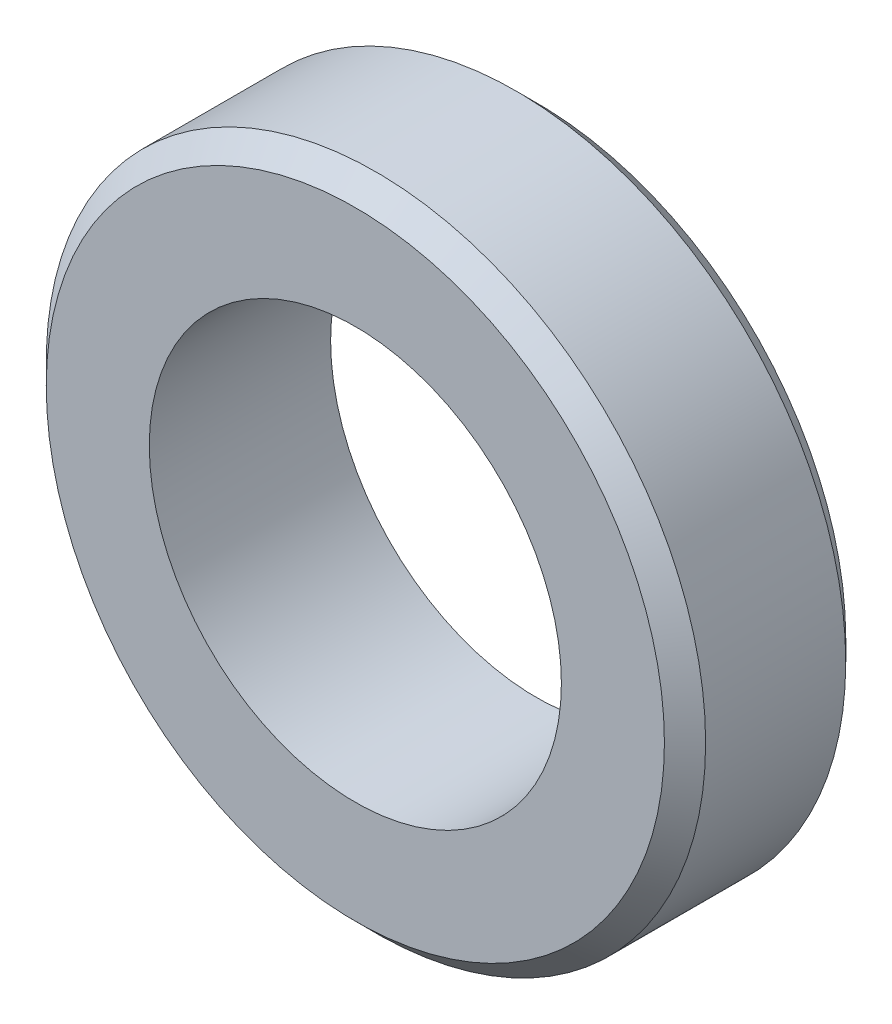
ISO-10303-21;
HEADER;
FILE_DESCRIPTION(('STEP AP214'),'2;1');
FILE_NAME('part.step','',(''),(''),'','','');
FILE_SCHEMA(('AUTOMOTIVE_DESIGN { 1 0 10303 214 1 1 1 1 }'));
ENDSEC;
DATA;
#1=APPLICATION_CONTEXT('core data for automotive mechanical design processes');
#2=APPLICATION_PROTOCOL_DEFINITION('international standard','automotive_design',2000,#1);
#3=PRODUCT_CONTEXT('',#1,'mechanical');
#4=PRODUCT('Part','Part','',(#3));
#5=PRODUCT_RELATED_PRODUCT_CATEGORY('part','',(#4));
#6=PRODUCT_DEFINITION_FORMATION('','',#4);
#7=PRODUCT_DEFINITION_CONTEXT('part definition',#1,'design');
#8=PRODUCT_DEFINITION('design','',#6,#7);
#9=PRODUCT_DEFINITION_SHAPE('','',#8);
#10=(LENGTH_UNIT() NAMED_UNIT(*) SI_UNIT(.MILLI.,.METRE.));
#11=(NAMED_UNIT(*) PLANE_ANGLE_UNIT() SI_UNIT($,.RADIAN.));
#12=(NAMED_UNIT(*) SI_UNIT($,.STERADIAN.) SOLID_ANGLE_UNIT());
#13=UNCERTAINTY_MEASURE_WITH_UNIT(LENGTH_MEASURE(1.E-05),#10,'distance_accuracy_value','');
#14=(GEOMETRIC_REPRESENTATION_CONTEXT(3) GLOBAL_UNCERTAINTY_ASSIGNED_CONTEXT((#13)) GLOBAL_UNIT_ASSIGNED_CONTEXT((#10,
#11,#12)) REPRESENTATION_CONTEXT('',''));
#15=CARTESIAN_POINT('',(0.,0.,0.));
#16=DIRECTION('',(0.,0.,1.));
#17=DIRECTION('',(1.,0.,0.));
#18=AXIS2_PLACEMENT_3D('',#15,#16,#17);
#19=CARTESIAN_POINT('',(0.,0.,6.985));
#20=DIRECTION('',(0.,0.,1.));
#21=DIRECTION('',(1.,0.,0.));
#22=AXIS2_PLACEMENT_3D('',#19,#20,#21);
#23=PLANE('',#22);
#24=CARTESIAN_POINT('',(0.,0.,6.985));
#25=DIRECTION('',(0.,0.,1.));
#26=DIRECTION('',(1.,0.,0.));
#27=AXIS2_PLACEMENT_3D('',#24,#25,#26);
#28=CIRCLE('',#27,11.90625);
#29=CARTESIAN_POINT('',(11.90625,0.,6.985));
#30=VERTEX_POINT('',#29);
#31=EDGE_CURVE('E10',#30,#30,#28,.T.);
#32=ORIENTED_EDGE('',*,*,#31,.T.);
#33=EDGE_LOOP('',(#32));
#34=FACE_BOUND('',#33,.T.);
#35=CARTESIAN_POINT('',(0.,0.,6.985));
#36=DIRECTION('',(0.,0.,1.));
#37=DIRECTION('',(1.,0.,0.));
#38=AXIS2_PLACEMENT_3D('',#35,#36,#37);
#39=CIRCLE('',#38,7.9375);
#40=CARTESIAN_POINT('',(7.9375,0.,6.985));
#41=VERTEX_POINT('',#40);
#42=EDGE_CURVE('E70',#41,#41,#39,.T.);
#43=ORIENTED_EDGE('',*,*,#42,.F.);
#44=EDGE_LOOP('',(#43));
#45=FACE_BOUND('',#44,.T.);
#46=ADVANCED_FACE('F45',(#34,#45),#23,.T.);
#47=CARTESIAN_POINT('',(0.,0.,0.));
#48=DIRECTION('',(0.,0.,1.));
#49=DIRECTION('',(1.,0.,0.));
#50=AXIS2_PLACEMENT_3D('',#47,#48,#49);
#51=PLANE('',#50);
#52=CARTESIAN_POINT('',(0.,0.,0.));
#53=DIRECTION('',(0.,0.,1.));
#54=DIRECTION('',(1.,0.,0.));
#55=AXIS2_PLACEMENT_3D('',#52,#53,#54);
#56=CIRCLE('',#55,11.90625);
#57=CARTESIAN_POINT('',(11.90625,0.,0.));
#58=VERTEX_POINT('',#57);
#59=EDGE_CURVE('E54',#58,#58,#56,.F.);
#60=ORIENTED_EDGE('',*,*,#59,.T.);
#61=EDGE_LOOP('',(#60));
#62=FACE_BOUND('',#61,.T.);
#63=CARTESIAN_POINT('',(0.,0.,0.));
#64=DIRECTION('',(0.,0.,1.));
#65=DIRECTION('',(1.,0.,0.));
#66=AXIS2_PLACEMENT_3D('',#63,#64,#65);
#67=CIRCLE('',#66,7.9375);
#68=CARTESIAN_POINT('',(7.9375,0.,0.));
#69=VERTEX_POINT('',#68);
#70=EDGE_CURVE('E71',#69,#69,#67,.T.);
#71=ORIENTED_EDGE('',*,*,#70,.T.);
#72=EDGE_LOOP('',(#71));
#73=FACE_BOUND('',#72,.T.);
#74=ADVANCED_FACE('F83',(#62,#73),#51,.F.);
#75=CARTESIAN_POINT('',(0.,0.,6.985));
#76=DIRECTION('',(0.,0.,-1.));
#77=DIRECTION('',(-1.,0.,0.));
#78=AXIS2_PLACEMENT_3D('',#75,#76,#77);
#79=CYLINDRICAL_SURFACE('',#78,12.7);
#80=CARTESIAN_POINT('',(0.,0.,0.793750000000001));
#81=DIRECTION('',(0.,0.,1.));
#82=DIRECTION('',(1.,0.,0.));
#83=AXIS2_PLACEMENT_3D('',#80,#81,#82);
#84=CIRCLE('',#83,12.7);
#85=CARTESIAN_POINT('',(12.7,0.,0.793750000000001));
#86=VERTEX_POINT('',#85);
#87=EDGE_CURVE('E59',#86,#86,#84,.T.);
#88=ORIENTED_EDGE('',*,*,#87,.T.);
#89=EDGE_LOOP('',(#88));
#90=FACE_BOUND('',#89,.T.);
#91=CARTESIAN_POINT('',(0.,0.,6.19124999999999));
#92=DIRECTION('',(0.,0.,1.));
#93=DIRECTION('',(1.,0.,0.));
#94=AXIS2_PLACEMENT_3D('',#91,#92,#93);
#95=CIRCLE('',#94,12.7);
#96=CARTESIAN_POINT('',(12.7,0.,6.19124999999999));
#97=VERTEX_POINT('',#96);
#98=EDGE_CURVE('E64',#97,#97,#95,.F.);
#99=ORIENTED_EDGE('',*,*,#98,.T.);
#100=EDGE_LOOP('',(#99));
#101=FACE_BOUND('',#100,.T.);
#102=ADVANCED_FACE('F89',(#90,#101),#79,.T.);
#103=CARTESIAN_POINT('',(0.,0.,6.985));
#104=DIRECTION('',(0.,0.,-1.));
#105=DIRECTION('',(-1.,0.,0.));
#106=AXIS2_PLACEMENT_3D('',#103,#104,#105);
#107=CYLINDRICAL_SURFACE('',#106,7.9375);
#108=ORIENTED_EDGE('',*,*,#42,.T.);
#109=EDGE_LOOP('',(#108));
#110=FACE_BOUND('',#109,.T.);
#111=ORIENTED_EDGE('',*,*,#70,.F.);
#112=EDGE_LOOP('',(#111));
#113=FACE_BOUND('',#112,.T.);
#114=ADVANCED_FACE('F79',(#110,#113),#107,.F.);
#115=CARTESIAN_POINT('',(0.,0.,0.793750000000001));
#116=DIRECTION('',(0.,0.,1.));
#117=DIRECTION('',(1.,0.,0.));
#118=AXIS2_PLACEMENT_3D('',#115,#116,#117);
#119=CONICAL_SURFACE('',#118,12.7,0.785398163397449);
#120=CARTESIAN_POINT('',(11.90625,0.,0.));
#121=CARTESIAN_POINT('',(11.9145182291667,0.,0.00826822916666704));
#122=CARTESIAN_POINT('',(11.9227864583333,0.,0.0165364583333336));
#123=CARTESIAN_POINT('',(11.9393229166667,0.,0.0330729166666666));
#124=CARTESIAN_POINT('',(11.9475911458333,0.,0.0413411458333332));
#125=CARTESIAN_POINT('',(11.9641276041667,0.,0.0578776041666665));
#126=CARTESIAN_POINT('',(11.9723958333333,0.,0.0661458333333333));
#127=CARTESIAN_POINT('',(11.9889322916667,0.,0.0826822916666668));
#128=CARTESIAN_POINT('',(11.9972005208333,0.,0.0909505208333336));
#129=CARTESIAN_POINT('',(12.0137369791667,0.,0.107486979166667));
#130=CARTESIAN_POINT('',(12.0220052083333,0.,0.115755208333333));
#131=CARTESIAN_POINT('',(12.0385416666667,0.,0.132291666666667));
#132=CARTESIAN_POINT('',(12.0468098958333,0.,0.140559895833334));
#133=CARTESIAN_POINT('',(12.0633463541667,0.,0.157096354166667));
#134=CARTESIAN_POINT('',(12.0716145833333,0.,0.165364583333333));
#135=CARTESIAN_POINT('',(12.0881510416667,0.,0.181901041666667));
#136=CARTESIAN_POINT('',(12.0964192708333,0.,0.190169270833333));
#137=CARTESIAN_POINT('',(12.1129557291667,0.,0.206705729166667));
#138=CARTESIAN_POINT('',(12.1212239583333,0.,0.214973958333334));
#139=CARTESIAN_POINT('',(12.1377604166667,0.,0.231510416666667));
#140=CARTESIAN_POINT('',(12.1460286458333,0.,0.239778645833334));
#141=CARTESIAN_POINT('',(12.1625651041667,0.,0.256315104166667));
#142=CARTESIAN_POINT('',(12.1708333333333,0.,0.264583333333334));
#143=CARTESIAN_POINT('',(12.1873697916667,0.,0.281119791666667));
#144=CARTESIAN_POINT('',(12.1956380208333,0.,0.289388020833334));
#145=CARTESIAN_POINT('',(12.2121744791667,0.,0.305924479166667));
#146=CARTESIAN_POINT('',(12.2204427083333,0.,0.314192708333333));
#147=CARTESIAN_POINT('',(12.2369791666667,0.,0.330729166666667));
#148=CARTESIAN_POINT('',(12.2452473958333,0.,0.338997395833334));
#149=CARTESIAN_POINT('',(12.2617838541667,0.,0.355533854166667));
#150=CARTESIAN_POINT('',(12.2700520833333,0.,0.363802083333334));
#151=CARTESIAN_POINT('',(12.2865885416667,0.,0.380338541666667));
#152=CARTESIAN_POINT('',(12.2948567708333,0.,0.388606770833334));
#153=CARTESIAN_POINT('',(12.3113932291667,0.,0.405143229166667));
#154=CARTESIAN_POINT('',(12.3196614583333,0.,0.413411458333334));
#155=CARTESIAN_POINT('',(12.3361979166667,0.,0.429947916666667));
#156=CARTESIAN_POINT('',(12.3444661458333,0.,0.438216145833334));
#157=CARTESIAN_POINT('',(12.3610026041667,0.,0.454752604166667));
#158=CARTESIAN_POINT('',(12.3692708333333,0.,0.463020833333334));
#159=CARTESIAN_POINT('',(12.3858072916667,0.,0.479557291666667));
#160=CARTESIAN_POINT('',(12.3940755208333,0.,0.487825520833334));
#161=CARTESIAN_POINT('',(12.4106119791667,0.,0.504361979166667));
#162=CARTESIAN_POINT('',(12.4188802083333,0.,0.512630208333334));
#163=CARTESIAN_POINT('',(12.4354166666667,0.,0.529166666666667));
#164=CARTESIAN_POINT('',(12.4436848958333,0.,0.537434895833334));
#165=CARTESIAN_POINT('',(12.4602213541667,0.,0.553971354166667));
#166=CARTESIAN_POINT('',(12.4684895833333,0.,0.562239583333334));
#167=CARTESIAN_POINT('',(12.4850260416667,0.,0.578776041666667));
#168=CARTESIAN_POINT('',(12.4932942708333,0.,0.587044270833334));
#169=CARTESIAN_POINT('',(12.5098307291667,0.,0.603580729166667));
#170=CARTESIAN_POINT('',(12.5180989583333,0.,0.611848958333334));
#171=CARTESIAN_POINT('',(12.5346354166667,0.,0.628385416666667));
#172=CARTESIAN_POINT('',(12.5429036458333,0.,0.636653645833334));
#173=CARTESIAN_POINT('',(12.5594401041667,0.,0.653190104166667));
#174=CARTESIAN_POINT('',(12.5677083333333,0.,0.661458333333334));
#175=CARTESIAN_POINT('',(12.5842447916667,0.,0.677994791666668));
#176=CARTESIAN_POINT('',(12.5925130208333,0.,0.686263020833334));
#177=CARTESIAN_POINT('',(12.6090494791667,0.,0.702799479166668));
#178=CARTESIAN_POINT('',(12.6173177083333,0.,0.711067708333334));
#179=CARTESIAN_POINT('',(12.6338541666667,0.,0.727604166666667));
#180=CARTESIAN_POINT('',(12.6421223958333,0.,0.735872395833334));
#181=CARTESIAN_POINT('',(12.6586588541667,0.,0.752408854166668));
#182=CARTESIAN_POINT('',(12.6669270833333,0.,0.760677083333334));
#183=CARTESIAN_POINT('',(12.6834635416667,0.,0.777213541666667));
#184=CARTESIAN_POINT('',(12.6917317708333,0.,0.785481770833334));
#185=CARTESIAN_POINT('',(12.7,0.,0.793750000000001));
#186=B_SPLINE_CURVE_WITH_KNOTS('',3,(#120,#121,#122,#123,#124,#125,#126,#127,#128,#129,#130,
#131,#132,#133,#134,#135,#136,#137,#138,#139,#140,#141,#142,#143,#144,#145,#146,#147,#148,#149,
#150,#151,#152,#153,#154,#155,#156,#157,#158,#159,#160,#161,#162,#163,#164,#165,#166,#167,#168,
#169,#170,#171,#172,#173,#174,#175,#176,#177,#178,#179,#180,#181,#182,#183,#184,#185),
.UNSPECIFIED.,.F.,.F.,(4,2,2,2,2,2,2,2,2,2,2,2,2,2,2,2,2,2,2,2,2,2,2,2,2,2,2,2,2,2,2,2,4),(0.,
0.035079125472926,0.0701582509458532,0.105237376418779,0.140316501891705,0.175395627364633,
0.210474752837559,0.245553878310486,0.280633003783412,0.315712129256338,0.350791254729265,
0.385870380202191,0.420949505675117,0.456028631148044,0.49110775662097,0.526186882093898,
0.561266007566824,0.59634513303975,0.631424258512677,0.666503383985603,0.701582509458529,
0.736661634931456,0.771740760404382,0.806819885877309,0.841899011350235,0.876978136823161,
0.912057262296088,0.947136387769014,0.98221551324194,1.01729463871487,1.05237376418779,
1.08745288966072,1.12253201513365),.UNSPECIFIED.);
#187=EDGE_CURVE('BSEAM96',#58,#86,#186,.T.);
#188=ORIENTED_EDGE('',*,*,#59,.F.);
#189=ORIENTED_EDGE('',*,*,#87,.F.);
#190=ORIENTED_EDGE('',*,*,#187,.T.);
#191=ORIENTED_EDGE('',*,*,#187,.F.);
#192=EDGE_LOOP('',(#188,#190,#189,#191));
#193=FACE_BOUND('',#192,.T.);
#194=ADVANCED_FACE('F96',(#193),#119,.T.);
#195=CARTESIAN_POINT('',(0.,0.,6.985));
#196=DIRECTION('',(0.,0.,-1.));
#197=DIRECTION('',(-1.,0.,0.));
#198=AXIS2_PLACEMENT_3D('',#195,#196,#197);
#199=CONICAL_SURFACE('',#198,11.90625,0.785398163397447);
#200=ORIENTED_EDGE('',*,*,#98,.F.);
#201=EDGE_LOOP('',(#200));
#202=FACE_BOUND('',#201,.T.);
#203=ORIENTED_EDGE('',*,*,#31,.F.);
#204=EDGE_LOOP('',(#203));
#205=FACE_BOUND('',#204,.T.);
#206=ADVANCED_FACE('F48',(#202,#205),#199,.T.);
#207=CLOSED_SHELL('',(#46,#74,#102,#114,#194,#206));
#208=MANIFOLD_SOLID_BREP('B2',#207);
#209=ADVANCED_BREP_SHAPE_REPRESENTATION('',(#18,#208),#14);
#210=SHAPE_DEFINITION_REPRESENTATION(#9,#209);
ENDSEC;
END-ISO-10303-21;
